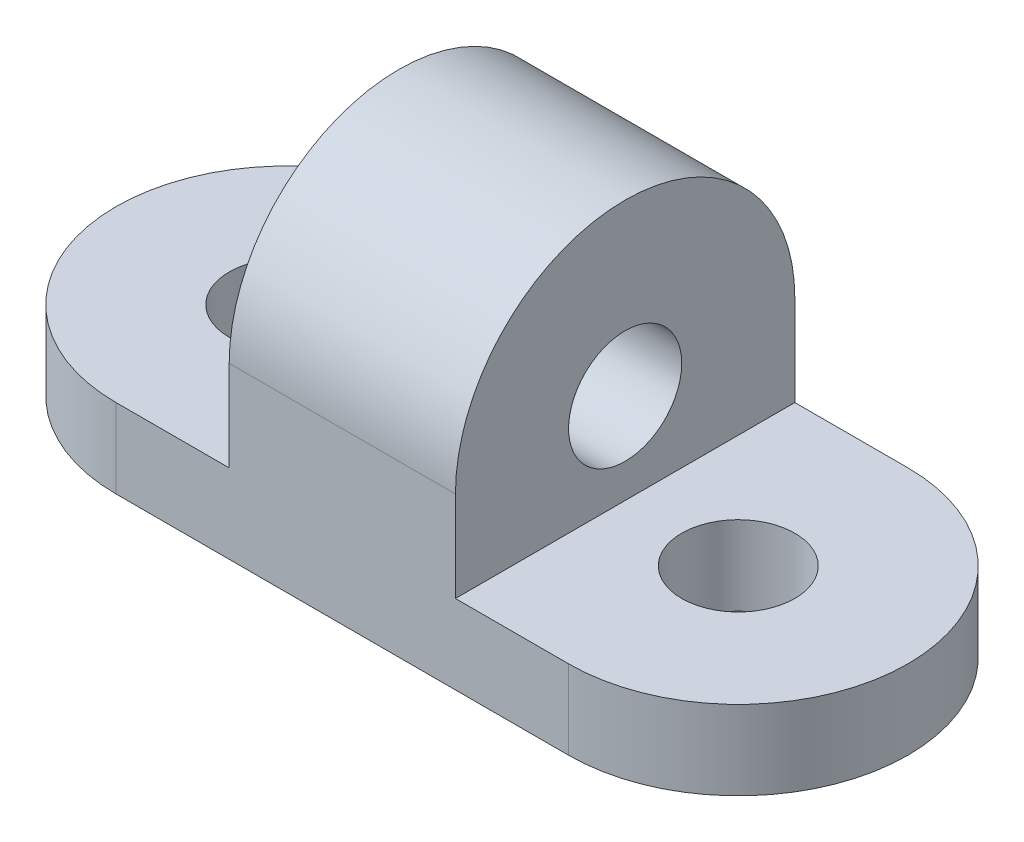
ISO-10303-21;
HEADER;
FILE_DESCRIPTION(('STEP AP214'),'2;1');
FILE_NAME('part.step','',(''),(''),'','','');
FILE_SCHEMA(('AUTOMOTIVE_DESIGN { 1 0 10303 214 1 1 1 1 }'));
ENDSEC;
DATA;
#1=APPLICATION_CONTEXT('core data for automotive mechanical design processes');
#2=APPLICATION_PROTOCOL_DEFINITION('international standard','automotive_design',2000,#1);
#3=PRODUCT_CONTEXT('',#1,'mechanical');
#4=PRODUCT('Part','Part','',(#3));
#5=PRODUCT_RELATED_PRODUCT_CATEGORY('part','',(#4));
#6=PRODUCT_DEFINITION_FORMATION('','',#4);
#7=PRODUCT_DEFINITION_CONTEXT('part definition',#1,'design');
#8=PRODUCT_DEFINITION('design','',#6,#7);
#9=PRODUCT_DEFINITION_SHAPE('','',#8);
#10=(LENGTH_UNIT() NAMED_UNIT(*) SI_UNIT(.MILLI.,.METRE.));
#11=(NAMED_UNIT(*) PLANE_ANGLE_UNIT() SI_UNIT($,.RADIAN.));
#12=(NAMED_UNIT(*) SI_UNIT($,.STERADIAN.) SOLID_ANGLE_UNIT());
#13=UNCERTAINTY_MEASURE_WITH_UNIT(LENGTH_MEASURE(1.E-05),#10,'distance_accuracy_value','');
#14=(GEOMETRIC_REPRESENTATION_CONTEXT(3) GLOBAL_UNCERTAINTY_ASSIGNED_CONTEXT((#13)) GLOBAL_UNIT_ASSIGNED_CONTEXT((#10,
#11,#12)) REPRESENTATION_CONTEXT('',''));
#15=CARTESIAN_POINT('',(0.,0.,0.));
#16=DIRECTION('',(0.,0.,1.));
#17=DIRECTION('',(1.,0.,0.));
#18=AXIS2_PLACEMENT_3D('',#15,#16,#17);
#19=CARTESIAN_POINT('',(0.,14.,-30.));
#20=DIRECTION('',(0.,1.,0.));
#21=DIRECTION('',(0.,0.,1.));
#22=AXIS2_PLACEMENT_3D('',#19,#20,#21);
#23=PLANE('',#22);
#24=CARTESIAN_POINT('',(0.,14.,-30.));
#25=DIRECTION('',(0.,1.,0.));
#26=DIRECTION('',(0.,0.,1.));
#27=AXIS2_PLACEMENT_3D('',#24,#25,#26);
#28=CIRCLE('',#27,10.);
#29=CARTESIAN_POINT('',(0.,14.,-20.));
#30=VERTEX_POINT('',#29);
#31=EDGE_CURVE('E155',#30,#30,#28,.T.);
#32=ORIENTED_EDGE('',*,*,#31,.F.);
#33=EDGE_LOOP('',(#32));
#34=FACE_BOUND('',#33,.T.);
#35=DIRECTION('',(1.,0.,0.));
#36=VECTOR('',#35,1.);
#37=CARTESIAN_POINT('',(0.,14.,0.));
#38=LINE('',#37,#36);
#39=CARTESIAN_POINT('',(0.,14.,0.));
#40=VERTEX_POINT('',#39);
#41=CARTESIAN_POINT('',(20.,14.,0.));
#42=VERTEX_POINT('',#41);
#43=EDGE_CURVE('E166',#40,#42,#38,.T.);
#44=ORIENTED_EDGE('',*,*,#43,.T.);
#45=DIRECTION('',(0.,0.,-1.));
#46=VECTOR('',#45,1.);
#47=CARTESIAN_POINT('',(20.,14.,-60.));
#48=LINE('',#47,#46);
#49=CARTESIAN_POINT('',(20.,14.,-60.));
#50=VERTEX_POINT('',#49);
#51=EDGE_CURVE('E54',#42,#50,#48,.T.);
#52=ORIENTED_EDGE('',*,*,#51,.T.);
#53=DIRECTION('',(-1.,0.,0.));
#54=VECTOR('',#53,1.);
#55=CARTESIAN_POINT('',(80.,14.,-60.));
#56=LINE('',#55,#54);
#57=CARTESIAN_POINT('',(0.,14.,-60.));
#58=VERTEX_POINT('',#57);
#59=EDGE_CURVE('E112',#50,#58,#56,.T.);
#60=ORIENTED_EDGE('',*,*,#59,.T.);
#61=CARTESIAN_POINT('',(0.,14.,-30.));
#62=DIRECTION('',(0.,1.,0.));
#63=DIRECTION('',(0.,0.,1.));
#64=AXIS2_PLACEMENT_3D('',#61,#62,#63);
#65=CIRCLE('',#64,30.);
#66=EDGE_CURVE('E161',#58,#40,#65,.T.);
#67=ORIENTED_EDGE('',*,*,#66,.T.);
#68=EDGE_LOOP('',(#44,#52,#60,#67));
#69=FACE_BOUND('',#68,.T.);
#70=ADVANCED_FACE('F39',(#34,#69),#23,.T.);
#71=DIRECTION('',(0.,0.,-1.));
#72=VECTOR('',#71,1.);
#73=CARTESIAN_POINT('',(60.,14.,-60.));
#74=LINE('',#73,#72);
#75=CARTESIAN_POINT('',(60.,14.,0.));
#76=VERTEX_POINT('',#75);
#77=CARTESIAN_POINT('',(60.,14.,-60.));
#78=VERTEX_POINT('',#77);
#79=EDGE_CURVE('E62',#76,#78,#74,.T.);
#80=ORIENTED_EDGE('',*,*,#79,.F.);
#81=CARTESIAN_POINT('',(80.,14.,0.));
#82=VERTEX_POINT('',#81);
#83=EDGE_CURVE('E164',#76,#82,#38,.T.);
#84=ORIENTED_EDGE('',*,*,#83,.T.);
#85=CARTESIAN_POINT('',(80.,14.,-30.));
#86=DIRECTION('',(0.,1.,0.));
#87=DIRECTION('',(0.,0.,-1.));
#88=AXIS2_PLACEMENT_3D('',#85,#86,#87);
#89=CIRCLE('',#88,30.);
#90=CARTESIAN_POINT('',(80.,14.,-60.));
#91=VERTEX_POINT('',#90);
#92=EDGE_CURVE('E107',#82,#91,#89,.T.);
#93=ORIENTED_EDGE('',*,*,#92,.T.);
#94=EDGE_CURVE('E102',#91,#78,#56,.T.);
#95=ORIENTED_EDGE('',*,*,#94,.T.);
#96=EDGE_LOOP('',(#80,#84,#93,#95));
#97=FACE_BOUND('',#96,.T.);
#98=CARTESIAN_POINT('',(80.,14.,-30.));
#99=DIRECTION('',(0.,1.,0.));
#100=DIRECTION('',(0.,0.,1.));
#101=AXIS2_PLACEMENT_3D('',#98,#99,#100);
#102=CIRCLE('',#101,9.99999999999999);
#103=CARTESIAN_POINT('',(80.,14.,-20.));
#104=VERTEX_POINT('',#103);
#105=EDGE_CURVE('E149',#104,#104,#102,.T.);
#106=ORIENTED_EDGE('',*,*,#105,.F.);
#107=EDGE_LOOP('',(#106));
#108=FACE_BOUND('',#107,.T.);
#109=ADVANCED_FACE('F104',(#97,#108),#23,.T.);
#110=CARTESIAN_POINT('',(0.,0.,-30.));
#111=DIRECTION('',(0.,1.,0.));
#112=DIRECTION('',(0.,0.,1.));
#113=AXIS2_PLACEMENT_3D('',#110,#111,#112);
#114=PLANE('',#113);
#115=CARTESIAN_POINT('',(0.,0.,-30.));
#116=DIRECTION('',(0.,1.,0.));
#117=DIRECTION('',(0.,0.,1.));
#118=AXIS2_PLACEMENT_3D('',#115,#116,#117);
#119=CIRCLE('',#118,30.);
#120=CARTESIAN_POINT('',(0.,0.,-60.));
#121=VERTEX_POINT('',#120);
#122=CARTESIAN_POINT('',(0.,0.,0.));
#123=VERTEX_POINT('',#122);
#124=EDGE_CURVE('E158',#121,#123,#119,.T.);
#125=ORIENTED_EDGE('',*,*,#124,.F.);
#126=DIRECTION('',(-1.,0.,0.));
#127=VECTOR('',#126,1.);
#128=CARTESIAN_POINT('',(80.,0.,-60.));
#129=LINE('',#128,#127);
#130=CARTESIAN_POINT('',(80.,0.,-60.));
#131=VERTEX_POINT('',#130);
#132=EDGE_CURVE('E165',#131,#121,#129,.T.);
#133=ORIENTED_EDGE('',*,*,#132,.F.);
#134=CARTESIAN_POINT('',(80.,0.,-30.));
#135=DIRECTION('',(0.,1.,0.));
#136=DIRECTION('',(0.,0.,-1.));
#137=AXIS2_PLACEMENT_3D('',#134,#135,#136);
#138=CIRCLE('',#137,30.);
#139=CARTESIAN_POINT('',(80.,0.,0.));
#140=VERTEX_POINT('',#139);
#141=EDGE_CURVE('E173',#140,#131,#138,.T.);
#142=ORIENTED_EDGE('',*,*,#141,.F.);
#143=DIRECTION('',(1.,0.,0.));
#144=VECTOR('',#143,1.);
#145=CARTESIAN_POINT('',(0.,0.,0.));
#146=LINE('',#145,#144);
#147=EDGE_CURVE('E171',#123,#140,#146,.T.);
#148=ORIENTED_EDGE('',*,*,#147,.F.);
#149=EDGE_LOOP('',(#125,#133,#142,#148));
#150=FACE_BOUND('',#149,.T.);
#151=CARTESIAN_POINT('',(0.,0.,-30.));
#152=DIRECTION('',(0.,1.,0.));
#153=DIRECTION('',(0.,0.,1.));
#154=AXIS2_PLACEMENT_3D('',#151,#152,#153);
#155=CIRCLE('',#154,10.);
#156=CARTESIAN_POINT('',(0.,0.,-20.));
#157=VERTEX_POINT('',#156);
#158=EDGE_CURVE('E152',#157,#157,#155,.T.);
#159=ORIENTED_EDGE('',*,*,#158,.T.);
#160=EDGE_LOOP('',(#159));
#161=FACE_BOUND('',#160,.T.);
#162=CARTESIAN_POINT('',(80.,0.,-30.));
#163=DIRECTION('',(0.,1.,0.));
#164=DIRECTION('',(0.,0.,1.));
#165=AXIS2_PLACEMENT_3D('',#162,#163,#164);
#166=CIRCLE('',#165,9.99999999999999);
#167=CARTESIAN_POINT('',(80.,0.,-20.));
#168=VERTEX_POINT('',#167);
#169=EDGE_CURVE('E148',#168,#168,#166,.T.);
#170=ORIENTED_EDGE('',*,*,#169,.T.);
#171=EDGE_LOOP('',(#170));
#172=FACE_BOUND('',#171,.T.);
#173=ADVANCED_FACE('F188',(#150,#161,#172),#114,.F.);
#174=CARTESIAN_POINT('',(0.,14.,-30.));
#175=DIRECTION('',(0.,-1.,0.));
#176=DIRECTION('',(0.,0.,-1.));
#177=AXIS2_PLACEMENT_3D('',#174,#175,#176);
#178=CYLINDRICAL_SURFACE('',#177,30.);
#179=ORIENTED_EDGE('',*,*,#124,.T.);
#180=DIRECTION('',(0.,-1.,0.));
#181=VECTOR('',#180,1.);
#182=CARTESIAN_POINT('',(0.,14.,0.));
#183=LINE('',#182,#181);
#184=EDGE_CURVE('E11',#40,#123,#183,.T.);
#185=ORIENTED_EDGE('',*,*,#184,.F.);
#186=ORIENTED_EDGE('',*,*,#66,.F.);
#187=DIRECTION('',(0.,-1.,0.));
#188=VECTOR('',#187,1.);
#189=CARTESIAN_POINT('',(0.,14.,-60.));
#190=LINE('',#189,#188);
#191=EDGE_CURVE('E111',#58,#121,#190,.T.);
#192=ORIENTED_EDGE('',*,*,#191,.T.);
#193=EDGE_LOOP('',(#179,#185,#186,#192));
#194=FACE_BOUND('',#193,.T.);
#195=ADVANCED_FACE('F41',(#194),#178,.T.);
#196=CARTESIAN_POINT('',(0.,14.,0.));
#197=DIRECTION('',(0.,0.,-1.));
#198=DIRECTION('',(-1.,0.,0.));
#199=AXIS2_PLACEMENT_3D('',#196,#197,#198);
#200=PLANE('',#199);
#201=ORIENTED_EDGE('',*,*,#147,.T.);
#202=DIRECTION('',(0.,-1.,0.));
#203=VECTOR('',#202,1.);
#204=CARTESIAN_POINT('',(80.,14.,0.));
#205=LINE('',#204,#203);
#206=EDGE_CURVE('E47',#82,#140,#205,.T.);
#207=ORIENTED_EDGE('',*,*,#206,.F.);
#208=ORIENTED_EDGE('',*,*,#83,.F.);
#209=DIRECTION('',(0.,-1.,0.));
#210=VECTOR('',#209,1.);
#211=CARTESIAN_POINT('',(60.,30.,0.));
#212=LINE('',#211,#210);
#213=CARTESIAN_POINT('',(60.,30.,0.));
#214=VERTEX_POINT('',#213);
#215=EDGE_CURVE('E127',#214,#76,#212,.T.);
#216=ORIENTED_EDGE('',*,*,#215,.F.);
#217=DIRECTION('',(-1.,0.,0.));
#218=VECTOR('',#217,1.);
#219=CARTESIAN_POINT('',(60.,30.,0.));
#220=LINE('',#219,#218);
#221=CARTESIAN_POINT('',(20.,30.,0.));
#222=VERTEX_POINT('',#221);
#223=EDGE_CURVE('E139',#214,#222,#220,.T.);
#224=ORIENTED_EDGE('',*,*,#223,.T.);
#225=DIRECTION('',(0.,-1.,0.));
#226=VECTOR('',#225,1.);
#227=CARTESIAN_POINT('',(20.,30.,0.));
#228=LINE('',#227,#226);
#229=EDGE_CURVE('E128',#222,#42,#228,.T.);
#230=ORIENTED_EDGE('',*,*,#229,.T.);
#231=ORIENTED_EDGE('',*,*,#43,.F.);
#232=ORIENTED_EDGE('',*,*,#184,.T.);
#233=EDGE_LOOP('',(#201,#207,#208,#216,#224,#230,#231,#232));
#234=FACE_BOUND('',#233,.T.);
#235=ADVANCED_FACE('F203',(#234),#200,.F.);
#236=CARTESIAN_POINT('',(80.,14.,-30.));
#237=DIRECTION('',(0.,-1.,0.));
#238=DIRECTION('',(0.,0.,-1.));
#239=AXIS2_PLACEMENT_3D('',#236,#237,#238);
#240=CYLINDRICAL_SURFACE('',#239,30.);
#241=ORIENTED_EDGE('',*,*,#141,.T.);
#242=DIRECTION('',(0.,-1.,0.));
#243=VECTOR('',#242,1.);
#244=CARTESIAN_POINT('',(80.,14.,-60.));
#245=LINE('',#244,#243);
#246=EDGE_CURVE('E178',#91,#131,#245,.T.);
#247=ORIENTED_EDGE('',*,*,#246,.F.);
#248=ORIENTED_EDGE('',*,*,#92,.F.);
#249=ORIENTED_EDGE('',*,*,#206,.T.);
#250=EDGE_LOOP('',(#241,#247,#248,#249));
#251=FACE_BOUND('',#250,.T.);
#252=ADVANCED_FACE('F183',(#251),#240,.T.);
#253=CARTESIAN_POINT('',(80.,14.,-60.));
#254=DIRECTION('',(0.,0.,1.));
#255=DIRECTION('',(1.,0.,0.));
#256=AXIS2_PLACEMENT_3D('',#253,#254,#255);
#257=PLANE('',#256);
#258=ORIENTED_EDGE('',*,*,#132,.T.);
#259=ORIENTED_EDGE('',*,*,#191,.F.);
#260=ORIENTED_EDGE('',*,*,#59,.F.);
#261=DIRECTION('',(0.,1.,0.));
#262=VECTOR('',#261,1.);
#263=CARTESIAN_POINT('',(20.,14.,-60.));
#264=LINE('',#263,#262);
#265=CARTESIAN_POINT('',(20.,30.,-60.));
#266=VERTEX_POINT('',#265);
#267=EDGE_CURVE('E141',#50,#266,#264,.T.);
#268=ORIENTED_EDGE('',*,*,#267,.T.);
#269=DIRECTION('',(-1.,0.,0.));
#270=VECTOR('',#269,1.);
#271=CARTESIAN_POINT('',(60.,30.,-60.));
#272=LINE('',#271,#270);
#273=CARTESIAN_POINT('',(60.,30.,-60.));
#274=VERTEX_POINT('',#273);
#275=EDGE_CURVE('E118',#274,#266,#272,.T.);
#276=ORIENTED_EDGE('',*,*,#275,.F.);
#277=DIRECTION('',(0.,1.,0.));
#278=VECTOR('',#277,1.);
#279=CARTESIAN_POINT('',(60.,14.,-60.));
#280=LINE('',#279,#278);
#281=EDGE_CURVE('E115',#78,#274,#280,.T.);
#282=ORIENTED_EDGE('',*,*,#281,.F.);
#283=ORIENTED_EDGE('',*,*,#94,.F.);
#284=ORIENTED_EDGE('',*,*,#246,.T.);
#285=EDGE_LOOP('',(#258,#259,#260,#268,#276,#282,#283,#284));
#286=FACE_BOUND('',#285,.T.);
#287=ADVANCED_FACE('F116',(#286),#257,.F.);
#288=CARTESIAN_POINT('',(0.,14.,-30.));
#289=DIRECTION('',(0.,-1.,0.));
#290=DIRECTION('',(0.,0.,-1.));
#291=AXIS2_PLACEMENT_3D('',#288,#289,#290);
#292=CYLINDRICAL_SURFACE('',#291,10.);
#293=ORIENTED_EDGE('',*,*,#31,.T.);
#294=EDGE_LOOP('',(#293));
#295=FACE_BOUND('',#294,.T.);
#296=ORIENTED_EDGE('',*,*,#158,.F.);
#297=EDGE_LOOP('',(#296));
#298=FACE_BOUND('',#297,.T.);
#299=ADVANCED_FACE('F221',(#295,#298),#292,.F.);
#300=CARTESIAN_POINT('',(80.,14.,-30.));
#301=DIRECTION('',(0.,-1.,0.));
#302=DIRECTION('',(0.,0.,-1.));
#303=AXIS2_PLACEMENT_3D('',#300,#301,#302);
#304=CYLINDRICAL_SURFACE('',#303,9.99999999999999);
#305=ORIENTED_EDGE('',*,*,#105,.T.);
#306=EDGE_LOOP('',(#305));
#307=FACE_BOUND('',#306,.T.);
#308=ORIENTED_EDGE('',*,*,#169,.F.);
#309=EDGE_LOOP('',(#308));
#310=FACE_BOUND('',#309,.T.);
#311=ADVANCED_FACE('F229',(#307,#310),#304,.F.);
#312=CARTESIAN_POINT('',(60.,30.,-30.));
#313=DIRECTION('',(1.,0.,0.));
#314=DIRECTION('',(0.,0.,-1.));
#315=AXIS2_PLACEMENT_3D('',#312,#313,#314);
#316=PLANE('',#315);
#317=ORIENTED_EDGE('',*,*,#79,.T.);
#318=ORIENTED_EDGE('',*,*,#281,.T.);
#319=CARTESIAN_POINT('',(60.,30.,-30.));
#320=DIRECTION('',(1.,0.,0.));
#321=DIRECTION('',(0.,0.,-1.));
#322=AXIS2_PLACEMENT_3D('',#319,#320,#321);
#323=CIRCLE('',#322,30.);
#324=EDGE_CURVE('E121',#274,#214,#323,.T.);
#325=ORIENTED_EDGE('',*,*,#324,.T.);
#326=ORIENTED_EDGE('',*,*,#215,.T.);
#327=EDGE_LOOP('',(#317,#318,#325,#326));
#328=FACE_BOUND('',#327,.T.);
#329=CARTESIAN_POINT('',(60.,30.,-30.));
#330=DIRECTION('',(1.,0.,0.));
#331=DIRECTION('',(0.,0.,-1.));
#332=AXIS2_PLACEMENT_3D('',#329,#330,#331);
#333=CIRCLE('',#332,10.);
#334=CARTESIAN_POINT('',(60.,30.,-40.));
#335=VERTEX_POINT('',#334);
#336=EDGE_CURVE('E142',#335,#335,#333,.T.);
#337=ORIENTED_EDGE('',*,*,#336,.F.);
#338=EDGE_LOOP('',(#337));
#339=FACE_BOUND('',#338,.T.);
#340=ADVANCED_FACE('F124',(#328,#339),#316,.T.);
#341=CARTESIAN_POINT('',(20.,30.,-30.));
#342=DIRECTION('',(1.,0.,0.));
#343=DIRECTION('',(0.,0.,-1.));
#344=AXIS2_PLACEMENT_3D('',#341,#342,#343);
#345=PLANE('',#344);
#346=ORIENTED_EDGE('',*,*,#51,.F.);
#347=ORIENTED_EDGE('',*,*,#229,.F.);
#348=CARTESIAN_POINT('',(20.,30.,-30.));
#349=DIRECTION('',(1.,0.,0.));
#350=DIRECTION('',(0.,0.,-1.));
#351=AXIS2_PLACEMENT_3D('',#348,#349,#350);
#352=CIRCLE('',#351,30.);
#353=EDGE_CURVE('E131',#266,#222,#352,.T.);
#354=ORIENTED_EDGE('',*,*,#353,.F.);
#355=ORIENTED_EDGE('',*,*,#267,.F.);
#356=EDGE_LOOP('',(#346,#347,#354,#355));
#357=FACE_BOUND('',#356,.T.);
#358=CARTESIAN_POINT('',(20.,30.,-30.));
#359=DIRECTION('',(1.,0.,0.));
#360=DIRECTION('',(0.,0.,-1.));
#361=AXIS2_PLACEMENT_3D('',#358,#359,#360);
#362=CIRCLE('',#361,10.);
#363=CARTESIAN_POINT('',(20.,30.,-40.));
#364=VERTEX_POINT('',#363);
#365=EDGE_CURVE('E134',#364,#364,#362,.T.);
#366=ORIENTED_EDGE('',*,*,#365,.T.);
#367=EDGE_LOOP('',(#366));
#368=FACE_BOUND('',#367,.T.);
#369=ADVANCED_FACE('F197',(#357,#368),#345,.F.);
#370=CARTESIAN_POINT('',(60.,30.,-30.));
#371=DIRECTION('',(-1.,0.,0.));
#372=DIRECTION('',(0.,0.,1.));
#373=AXIS2_PLACEMENT_3D('',#370,#371,#372);
#374=CYLINDRICAL_SURFACE('',#373,30.);
#375=ORIENTED_EDGE('',*,*,#353,.T.);
#376=ORIENTED_EDGE('',*,*,#223,.F.);
#377=ORIENTED_EDGE('',*,*,#324,.F.);
#378=ORIENTED_EDGE('',*,*,#275,.T.);
#379=EDGE_LOOP('',(#375,#376,#377,#378));
#380=FACE_BOUND('',#379,.T.);
#381=ADVANCED_FACE('F202',(#380),#374,.T.);
#382=CARTESIAN_POINT('',(60.,30.,-30.));
#383=DIRECTION('',(-1.,0.,0.));
#384=DIRECTION('',(0.,0.,1.));
#385=AXIS2_PLACEMENT_3D('',#382,#383,#384);
#386=CYLINDRICAL_SURFACE('',#385,10.);
#387=ORIENTED_EDGE('',*,*,#336,.T.);
#388=EDGE_LOOP('',(#387));
#389=FACE_BOUND('',#388,.T.);
#390=ORIENTED_EDGE('',*,*,#365,.F.);
#391=EDGE_LOOP('',(#390));
#392=FACE_BOUND('',#391,.T.);
#393=ADVANCED_FACE('F245',(#389,#392),#386,.F.);
#394=CLOSED_SHELL('',(#70,#109,#173,#195,#235,#252,#287,#299,#311,#340,#369,#381,#393));
#395=MANIFOLD_SOLID_BREP('B2',#394);
#396=ADVANCED_BREP_SHAPE_REPRESENTATION('',(#18,#395),#14);
#397=SHAPE_DEFINITION_REPRESENTATION(#9,#396);
ENDSEC;
END-ISO-10303-21;
